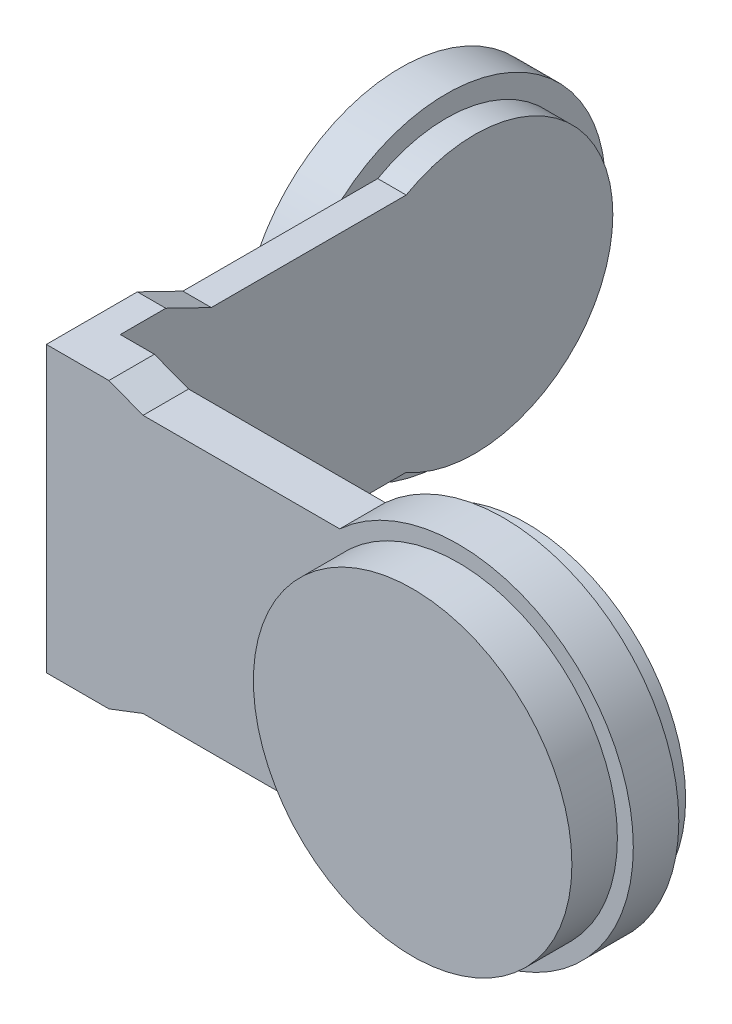
ISO-10303-21;
HEADER;
FILE_DESCRIPTION(('STEP AP214'),'2;1');
FILE_NAME('part.step','',(''),(''),'','','');
FILE_SCHEMA(('AUTOMOTIVE_DESIGN { 1 0 10303 214 1 1 1 1 }'));
ENDSEC;
DATA;
#1=APPLICATION_CONTEXT('core data for automotive mechanical design processes');
#2=APPLICATION_PROTOCOL_DEFINITION('international standard','automotive_design',2000,#1);
#3=PRODUCT_CONTEXT('',#1,'mechanical');
#4=PRODUCT('Part','Part','',(#3));
#5=PRODUCT_RELATED_PRODUCT_CATEGORY('part','',(#4));
#6=PRODUCT_DEFINITION_FORMATION('','',#4);
#7=PRODUCT_DEFINITION_CONTEXT('part definition',#1,'design');
#8=PRODUCT_DEFINITION('design','',#6,#7);
#9=PRODUCT_DEFINITION_SHAPE('','',#8);
#10=(LENGTH_UNIT() NAMED_UNIT(*) SI_UNIT(.MILLI.,.METRE.));
#11=(NAMED_UNIT(*) PLANE_ANGLE_UNIT() SI_UNIT($,.RADIAN.));
#12=(NAMED_UNIT(*) SI_UNIT($,.STERADIAN.) SOLID_ANGLE_UNIT());
#13=UNCERTAINTY_MEASURE_WITH_UNIT(LENGTH_MEASURE(1.E-05),#10,'distance_accuracy_value','');
#14=(GEOMETRIC_REPRESENTATION_CONTEXT(3) GLOBAL_UNCERTAINTY_ASSIGNED_CONTEXT((#13)) GLOBAL_UNIT_ASSIGNED_CONTEXT((#10,
#11,#12)) REPRESENTATION_CONTEXT('',''));
#15=CARTESIAN_POINT('',(0.,0.,0.));
#16=DIRECTION('',(0.,0.,1.));
#17=DIRECTION('',(1.,0.,0.));
#18=AXIS2_PLACEMENT_3D('',#15,#16,#17);
#19=CARTESIAN_POINT('',(6.5,0.,0.));
#20=DIRECTION('',(1.,0.,0.));
#21=DIRECTION('',(0.,0.,-1.));
#22=AXIS2_PLACEMENT_3D('',#19,#20,#21);
#23=PLANE('',#22);
#24=DIRECTION('',(0.,0.,1.));
#25=VECTOR('',#24,1.);
#26=CARTESIAN_POINT('',(6.5,12.5,35.15));
#27=LINE('',#26,#25);
#28=CARTESIAN_POINT('',(6.5,12.5,27.15));
#29=VERTEX_POINT('',#28);
#30=CARTESIAN_POINT('',(6.5,12.5,31.15));
#31=VERTEX_POINT('',#30);
#32=EDGE_CURVE('E218',#29,#31,#27,.T.);
#33=ORIENTED_EDGE('',*,*,#32,.T.);
#34=DIRECTION('',(0.,-1.,0.));
#35=VECTOR('',#34,1.);
#36=CARTESIAN_POINT('',(6.5,12.5,31.15));
#37=LINE('',#36,#35);
#38=CARTESIAN_POINT('',(6.5,-12.5,31.15));
#39=VERTEX_POINT('',#38);
#40=EDGE_CURVE('E164',#31,#39,#37,.T.);
#41=ORIENTED_EDGE('',*,*,#40,.T.);
#42=DIRECTION('',(0.,0.,-1.));
#43=VECTOR('',#42,1.);
#44=CARTESIAN_POINT('',(6.5,-12.5,35.15));
#45=LINE('',#44,#43);
#46=CARTESIAN_POINT('',(6.5,-12.5,27.15));
#47=VERTEX_POINT('',#46);
#48=EDGE_CURVE('E163',#39,#47,#45,.T.);
#49=ORIENTED_EDGE('',*,*,#48,.T.);
#50=DIRECTION('',(0.,0.437246930529629,-0.899341493395261));
#51=VECTOR('',#50,1.);
#52=CARTESIAN_POINT('',(6.5,-12.5,27.15));
#53=LINE('',#52,#51);
#54=CARTESIAN_POINT('',(6.5,-10.5552573911434,23.15));
#55=VERTEX_POINT('',#54);
#56=EDGE_CURVE('E206',#47,#55,#53,.T.);
#57=ORIENTED_EDGE('',*,*,#56,.T.);
#58=DIRECTION('',(0.,0.,-1.));
#59=VECTOR('',#58,1.);
#60=CARTESIAN_POINT('',(6.5,-10.5552573911434,23.15));
#61=LINE('',#60,#59);
#62=CARTESIAN_POINT('',(6.5,-10.5552573911434,6.0173949020081));
#63=VERTEX_POINT('',#62);
#64=EDGE_CURVE('E209',#55,#63,#61,.T.);
#65=ORIENTED_EDGE('',*,*,#64,.T.);
#66=CARTESIAN_POINT('',(6.5,0.,0.));
#67=DIRECTION('',(1.,0.,0.));
#68=DIRECTION('',(0.,0.,-1.));
#69=AXIS2_PLACEMENT_3D('',#66,#67,#68);
#70=CIRCLE('',#69,12.15);
#71=CARTESIAN_POINT('',(6.5,10.5552573911434,6.0173949020081));
#72=VERTEX_POINT('',#71);
#73=EDGE_CURVE('E212',#63,#72,#70,.T.);
#74=ORIENTED_EDGE('',*,*,#73,.T.);
#75=DIRECTION('',(0.,0.,1.));
#76=VECTOR('',#75,1.);
#77=CARTESIAN_POINT('',(6.5,10.5552573911434,23.15));
#78=LINE('',#77,#76);
#79=CARTESIAN_POINT('',(6.5,10.5552573911434,23.15));
#80=VERTEX_POINT('',#79);
#81=EDGE_CURVE('E214',#72,#80,#78,.T.);
#82=ORIENTED_EDGE('',*,*,#81,.T.);
#83=DIRECTION('',(0.,0.437246930529628,0.899341493395261));
#84=VECTOR('',#83,1.);
#85=CARTESIAN_POINT('',(6.5,12.5,27.15));
#86=LINE('',#85,#84);
#87=EDGE_CURVE('E216',#80,#29,#86,.T.);
#88=ORIENTED_EDGE('',*,*,#87,.T.);
#89=EDGE_LOOP('',(#33,#41,#49,#57,#65,#74,#82,#88));
#90=FACE_BOUND('',#89,.T.);
#91=ADVANCED_FACE('F35',(#90),#23,.T.);
#92=CARTESIAN_POINT('',(4.,0.,0.));
#93=DIRECTION('',(-1.,0.,0.));
#94=DIRECTION('',(0.,0.,1.));
#95=AXIS2_PLACEMENT_3D('',#92,#93,#94);
#96=CYLINDRICAL_SURFACE('',#95,14.);
#97=CARTESIAN_POINT('',(4.,0.,0.));
#98=DIRECTION('',(1.,0.,0.));
#99=DIRECTION('',(0.,0.,-1.));
#100=AXIS2_PLACEMENT_3D('',#97,#98,#99);
#101=CIRCLE('',#100,14.);
#102=CARTESIAN_POINT('',(4.,10.5552573911434,9.19709418276844));
#103=VERTEX_POINT('',#102);
#104=CARTESIAN_POINT('',(4.,-10.5552573911434,9.19709418276844));
#105=VERTEX_POINT('',#104);
#106=EDGE_CURVE('E263',#103,#105,#101,.T.);
#107=ORIENTED_EDGE('',*,*,#106,.F.);
#108=EDGE_CURVE('E265',#105,#103,#101,.T.);
#109=ORIENTED_EDGE('',*,*,#108,.F.);
#110=EDGE_LOOP('',(#107,#109));
#111=FACE_BOUND('',#110,.T.);
#112=CARTESIAN_POINT('',(0.,0.,0.));
#113=DIRECTION('',(1.,0.,0.));
#114=DIRECTION('',(0.,0.,-1.));
#115=AXIS2_PLACEMENT_3D('',#112,#113,#114);
#116=CIRCLE('',#115,14.);
#117=CARTESIAN_POINT('',(0.,0.,-14.));
#118=VERTEX_POINT('',#117);
#119=EDGE_CURVE('E262',#118,#118,#116,.T.);
#120=ORIENTED_EDGE('',*,*,#119,.T.);
#121=EDGE_LOOP('',(#120));
#122=FACE_BOUND('',#121,.T.);
#123=ADVANCED_FACE('F37',(#111,#122),#96,.T.);
#124=CARTESIAN_POINT('',(4.,0.,0.));
#125=DIRECTION('',(1.,0.,0.));
#126=DIRECTION('',(0.,0.,-1.));
#127=AXIS2_PLACEMENT_3D('',#124,#125,#126);
#128=PLANE('',#127);
#129=DIRECTION('',(0.,0.,1.));
#130=VECTOR('',#129,1.);
#131=CARTESIAN_POINT('',(4.,10.5552573911434,23.15));
#132=LINE('',#131,#130);
#133=CARTESIAN_POINT('',(4.,10.5552573911434,6.0173949020081));
#134=VERTEX_POINT('',#133);
#135=EDGE_CURVE('E58',#134,#103,#132,.T.);
#136=ORIENTED_EDGE('',*,*,#135,.F.);
#137=CARTESIAN_POINT('',(4.,0.,0.));
#138=DIRECTION('',(1.,0.,0.));
#139=DIRECTION('',(0.,0.,-1.));
#140=AXIS2_PLACEMENT_3D('',#137,#138,#139);
#141=CIRCLE('',#140,12.15);
#142=CARTESIAN_POINT('',(4.,-10.5552573911434,6.0173949020081));
#143=VERTEX_POINT('',#142);
#144=EDGE_CURVE('E228',#143,#134,#141,.T.);
#145=ORIENTED_EDGE('',*,*,#144,.F.);
#146=DIRECTION('',(0.,0.,-1.));
#147=VECTOR('',#146,1.);
#148=CARTESIAN_POINT('',(4.,-10.5552573911434,23.15));
#149=LINE('',#148,#147);
#150=EDGE_CURVE('E229',#105,#143,#149,.T.);
#151=ORIENTED_EDGE('',*,*,#150,.F.);
#152=ORIENTED_EDGE('',*,*,#108,.T.);
#153=EDGE_LOOP('',(#136,#145,#151,#152));
#154=FACE_BOUND('',#153,.T.);
#155=ADVANCED_FACE('F271',(#154),#128,.T.);
#156=CARTESIAN_POINT('',(0.,0.,0.));
#157=DIRECTION('',(1.,0.,0.));
#158=DIRECTION('',(0.,0.,-1.));
#159=AXIS2_PLACEMENT_3D('',#156,#157,#158);
#160=PLANE('',#159);
#161=ORIENTED_EDGE('',*,*,#119,.F.);
#162=EDGE_LOOP('',(#161));
#163=FACE_BOUND('',#162,.T.);
#164=ADVANCED_FACE('F332',(#163),#160,.F.);
#165=CARTESIAN_POINT('',(4.,0.,0.));
#166=DIRECTION('',(1.,0.,0.));
#167=DIRECTION('',(0.,0.,-1.));
#168=AXIS2_PLACEMENT_3D('',#165,#166,#167);
#169=PLANE('',#168);
#170=CARTESIAN_POINT('',(4.,10.5552573911434,23.15));
#171=VERTEX_POINT('',#170);
#172=EDGE_CURVE('E231',#103,#171,#132,.T.);
#173=ORIENTED_EDGE('',*,*,#172,.F.);
#174=ORIENTED_EDGE('',*,*,#106,.T.);
#175=CARTESIAN_POINT('',(4.,-10.5552573911434,23.15));
#176=VERTEX_POINT('',#175);
#177=EDGE_CURVE('E225',#176,#105,#149,.T.);
#178=ORIENTED_EDGE('',*,*,#177,.F.);
#179=DIRECTION('',(0.,0.437246930529629,-0.899341493395261));
#180=VECTOR('',#179,1.);
#181=CARTESIAN_POINT('',(4.,-12.5,27.15));
#182=LINE('',#181,#180);
#183=CARTESIAN_POINT('',(4.,-12.5,27.15));
#184=VERTEX_POINT('',#183);
#185=EDGE_CURVE('E198',#184,#176,#182,.T.);
#186=ORIENTED_EDGE('',*,*,#185,.F.);
#187=DIRECTION('',(0.,0.,-1.));
#188=VECTOR('',#187,1.);
#189=CARTESIAN_POINT('',(4.,-12.5,35.15));
#190=LINE('',#189,#188);
#191=CARTESIAN_POINT('',(4.,-12.5,35.15));
#192=VERTEX_POINT('',#191);
#193=EDGE_CURVE('E210',#192,#184,#190,.T.);
#194=ORIENTED_EDGE('',*,*,#193,.F.);
#195=DIRECTION('',(0.,-1.,0.));
#196=VECTOR('',#195,1.);
#197=CARTESIAN_POINT('',(4.,12.5,35.15));
#198=LINE('',#197,#196);
#199=CARTESIAN_POINT('',(4.,12.5,35.15));
#200=VERTEX_POINT('',#199);
#201=EDGE_CURVE('E237',#200,#192,#198,.T.);
#202=ORIENTED_EDGE('',*,*,#201,.F.);
#203=DIRECTION('',(0.,0.,1.));
#204=VECTOR('',#203,1.);
#205=CARTESIAN_POINT('',(4.,12.5,35.15));
#206=LINE('',#205,#204);
#207=CARTESIAN_POINT('',(4.,12.5,27.15));
#208=VERTEX_POINT('',#207);
#209=EDGE_CURVE('E235',#208,#200,#206,.T.);
#210=ORIENTED_EDGE('',*,*,#209,.F.);
#211=DIRECTION('',(0.,0.437246930529628,0.899341493395261));
#212=VECTOR('',#211,1.);
#213=CARTESIAN_POINT('',(4.,12.5,27.15));
#214=LINE('',#213,#212);
#215=EDGE_CURVE('E233',#171,#208,#214,.T.);
#216=ORIENTED_EDGE('',*,*,#215,.F.);
#217=EDGE_LOOP('',(#173,#174,#178,#186,#194,#202,#210,#216));
#218=FACE_BOUND('',#217,.T.);
#219=ADVANCED_FACE('F277',(#218),#169,.F.);
#220=CARTESIAN_POINT('',(6.5,-12.5,27.15));
#221=DIRECTION('',(0.,0.899341493395261,0.437246930529629));
#222=DIRECTION('',(0.,-0.437246930529629,0.899341493395261));
#223=AXIS2_PLACEMENT_3D('',#220,#221,#222);
#224=PLANE('',#223);
#225=ORIENTED_EDGE('',*,*,#185,.T.);
#226=DIRECTION('',(-1.,0.,0.));
#227=VECTOR('',#226,1.);
#228=CARTESIAN_POINT('',(6.5,-10.5552573911434,23.15));
#229=LINE('',#228,#227);
#230=EDGE_CURVE('E259',#55,#176,#229,.T.);
#231=ORIENTED_EDGE('',*,*,#230,.F.);
#232=ORIENTED_EDGE('',*,*,#56,.F.);
#233=DIRECTION('',(-1.,0.,0.));
#234=VECTOR('',#233,1.);
#235=CARTESIAN_POINT('',(6.5,-12.5,27.15));
#236=LINE('',#235,#234);
#237=EDGE_CURVE('E222',#47,#184,#236,.T.);
#238=ORIENTED_EDGE('',*,*,#237,.T.);
#239=EDGE_LOOP('',(#225,#231,#232,#238));
#240=FACE_BOUND('',#239,.T.);
#241=ADVANCED_FACE('F331',(#240),#224,.F.);
#242=CARTESIAN_POINT('',(6.5,-10.5552573911434,23.15));
#243=DIRECTION('',(0.,1.,0.));
#244=DIRECTION('',(0.,0.,1.));
#245=AXIS2_PLACEMENT_3D('',#242,#243,#244);
#246=PLANE('',#245);
#247=ORIENTED_EDGE('',*,*,#177,.T.);
#248=ORIENTED_EDGE('',*,*,#150,.T.);
#249=DIRECTION('',(-1.,0.,0.));
#250=VECTOR('',#249,1.);
#251=CARTESIAN_POINT('',(6.5,-10.5552573911434,6.0173949020081));
#252=LINE('',#251,#250);
#253=EDGE_CURVE('E256',#63,#143,#252,.T.);
#254=ORIENTED_EDGE('',*,*,#253,.F.);
#255=ORIENTED_EDGE('',*,*,#64,.F.);
#256=ORIENTED_EDGE('',*,*,#230,.T.);
#257=EDGE_LOOP('',(#247,#248,#254,#255,#256));
#258=FACE_BOUND('',#257,.T.);
#259=ADVANCED_FACE('F289',(#258),#246,.F.);
#260=CARTESIAN_POINT('',(6.5,0.,0.));
#261=DIRECTION('',(-1.,0.,0.));
#262=DIRECTION('',(0.,0.,1.));
#263=AXIS2_PLACEMENT_3D('',#260,#261,#262);
#264=CYLINDRICAL_SURFACE('',#263,12.15);
#265=ORIENTED_EDGE('',*,*,#144,.T.);
#266=DIRECTION('',(-1.,0.,0.));
#267=VECTOR('',#266,1.);
#268=CARTESIAN_POINT('',(6.5,10.5552573911434,6.0173949020081));
#269=LINE('',#268,#267);
#270=EDGE_CURVE('E253',#72,#134,#269,.T.);
#271=ORIENTED_EDGE('',*,*,#270,.F.);
#272=ORIENTED_EDGE('',*,*,#73,.F.);
#273=ORIENTED_EDGE('',*,*,#253,.T.);
#274=EDGE_LOOP('',(#265,#271,#272,#273));
#275=FACE_BOUND('',#274,.T.);
#276=ADVANCED_FACE('F286',(#275),#264,.T.);
#277=CARTESIAN_POINT('',(6.5,10.5552573911434,23.15));
#278=DIRECTION('',(0.,-1.,0.));
#279=DIRECTION('',(0.,0.,-1.));
#280=AXIS2_PLACEMENT_3D('',#277,#278,#279);
#281=PLANE('',#280);
#282=ORIENTED_EDGE('',*,*,#135,.T.);
#283=ORIENTED_EDGE('',*,*,#172,.T.);
#284=DIRECTION('',(-1.,0.,0.));
#285=VECTOR('',#284,1.);
#286=CARTESIAN_POINT('',(6.5,10.5552573911434,23.15));
#287=LINE('',#286,#285);
#288=EDGE_CURVE('E250',#80,#171,#287,.T.);
#289=ORIENTED_EDGE('',*,*,#288,.F.);
#290=ORIENTED_EDGE('',*,*,#81,.F.);
#291=ORIENTED_EDGE('',*,*,#270,.T.);
#292=EDGE_LOOP('',(#282,#283,#289,#290,#291));
#293=FACE_BOUND('',#292,.T.);
#294=ADVANCED_FACE('F281',(#293),#281,.F.);
#295=CARTESIAN_POINT('',(6.5,12.5,27.15));
#296=DIRECTION('',(0.,-0.899341493395261,0.437246930529628));
#297=DIRECTION('',(0.,-0.437246930529628,-0.899341493395261));
#298=AXIS2_PLACEMENT_3D('',#295,#296,#297);
#299=PLANE('',#298);
#300=ORIENTED_EDGE('',*,*,#215,.T.);
#301=DIRECTION('',(-1.,0.,0.));
#302=VECTOR('',#301,1.);
#303=CARTESIAN_POINT('',(6.5,12.5,27.15));
#304=LINE('',#303,#302);
#305=EDGE_CURVE('E247',#29,#208,#304,.T.);
#306=ORIENTED_EDGE('',*,*,#305,.F.);
#307=ORIENTED_EDGE('',*,*,#87,.F.);
#308=ORIENTED_EDGE('',*,*,#288,.T.);
#309=EDGE_LOOP('',(#300,#306,#307,#308));
#310=FACE_BOUND('',#309,.T.);
#311=ADVANCED_FACE('F343',(#310),#299,.F.);
#312=CARTESIAN_POINT('',(6.5,12.5,35.15));
#313=DIRECTION('',(0.,-1.,0.));
#314=DIRECTION('',(0.,0.,-1.));
#315=AXIS2_PLACEMENT_3D('',#312,#313,#314);
#316=PLANE('',#315);
#317=ORIENTED_EDGE('',*,*,#209,.T.);
#318=DIRECTION('',(-1.,0.,0.));
#319=VECTOR('',#318,1.);
#320=CARTESIAN_POINT('',(6.5,12.5,35.15));
#321=LINE('',#320,#319);
#322=CARTESIAN_POINT('',(9.5,12.5,35.15));
#323=VERTEX_POINT('',#322);
#324=EDGE_CURVE('E244',#323,#200,#321,.T.);
#325=ORIENTED_EDGE('',*,*,#324,.F.);
#326=DIRECTION('',(0.,0.,1.));
#327=VECTOR('',#326,1.);
#328=CARTESIAN_POINT('',(9.5,12.5,31.15));
#329=LINE('',#328,#327);
#330=CARTESIAN_POINT('',(9.5,12.5,31.15));
#331=VERTEX_POINT('',#330);
#332=EDGE_CURVE('E195',#331,#323,#329,.T.);
#333=ORIENTED_EDGE('',*,*,#332,.F.);
#334=DIRECTION('',(-1.,0.,0.));
#335=VECTOR('',#334,1.);
#336=CARTESIAN_POINT('',(6.5,12.5,31.15));
#337=LINE('',#336,#335);
#338=EDGE_CURVE('E152',#331,#31,#337,.T.);
#339=ORIENTED_EDGE('',*,*,#338,.T.);
#340=ORIENTED_EDGE('',*,*,#32,.F.);
#341=ORIENTED_EDGE('',*,*,#305,.T.);
#342=EDGE_LOOP('',(#317,#325,#333,#339,#340,#341));
#343=FACE_BOUND('',#342,.T.);
#344=ADVANCED_FACE('F339',(#343),#316,.F.);
#345=CARTESIAN_POINT('',(6.5,12.5,35.15));
#346=DIRECTION('',(0.,0.,-1.));
#347=DIRECTION('',(-1.,0.,0.));
#348=AXIS2_PLACEMENT_3D('',#345,#346,#347);
#349=PLANE('',#348);
#350=CARTESIAN_POINT('',(40.2,0.,35.15));
#351=DIRECTION('',(0.,0.,1.));
#352=DIRECTION('',(1.,0.,0.));
#353=AXIS2_PLACEMENT_3D('',#350,#351,#352);
#354=CIRCLE('',#353,14.);
#355=CARTESIAN_POINT('',(54.2,0.,35.15));
#356=VERTEX_POINT('',#355);
#357=EDGE_CURVE('E43',#356,#356,#354,.T.);
#358=ORIENTED_EDGE('',*,*,#357,.F.);
#359=EDGE_LOOP('',(#358));
#360=FACE_BOUND('',#359,.T.);
#361=ORIENTED_EDGE('',*,*,#201,.T.);
#362=DIRECTION('',(-1.,0.,0.));
#363=VECTOR('',#362,1.);
#364=CARTESIAN_POINT('',(6.5,-12.5,35.15));
#365=LINE('',#364,#363);
#366=CARTESIAN_POINT('',(9.5,-12.5,35.15));
#367=VERTEX_POINT('',#366);
#368=EDGE_CURVE('E242',#367,#192,#365,.T.);
#369=ORIENTED_EDGE('',*,*,#368,.F.);
#370=DIRECTION('',(0.933746117302049,0.357936011632454,0.));
#371=VECTOR('',#370,1.);
#372=CARTESIAN_POINT('',(9.5,-12.5,35.15));
#373=LINE('',#372,#371);
#374=CARTESIAN_POINT('',(12.5,-11.35,35.15));
#375=VERTEX_POINT('',#374);
#376=EDGE_CURVE('E148',#367,#375,#373,.T.);
#377=ORIENTED_EDGE('',*,*,#376,.T.);
#378=DIRECTION('',(1.,0.,0.));
#379=VECTOR('',#378,1.);
#380=CARTESIAN_POINT('',(12.5,-11.35,35.15));
#381=LINE('',#380,#379);
#382=CARTESIAN_POINT('',(29.7914698444017,-11.35,35.15));
#383=VERTEX_POINT('',#382);
#384=EDGE_CURVE('E183',#375,#383,#381,.T.);
#385=ORIENTED_EDGE('',*,*,#384,.T.);
#386=CARTESIAN_POINT('',(40.2,0.,35.15));
#387=DIRECTION('',(0.,0.,1.));
#388=DIRECTION('',(1.,0.,0.));
#389=AXIS2_PLACEMENT_3D('',#386,#387,#388);
#390=CIRCLE('',#389,15.4);
#391=CARTESIAN_POINT('',(29.7914698444017,11.35,35.15));
#392=VERTEX_POINT('',#391);
#393=EDGE_CURVE('E187',#383,#392,#390,.T.);
#394=ORIENTED_EDGE('',*,*,#393,.T.);
#395=DIRECTION('',(-1.,0.,0.));
#396=VECTOR('',#395,1.);
#397=CARTESIAN_POINT('',(12.5,11.35,35.15));
#398=LINE('',#397,#396);
#399=CARTESIAN_POINT('',(12.5,11.35,35.15));
#400=VERTEX_POINT('',#399);
#401=EDGE_CURVE('E190',#392,#400,#398,.T.);
#402=ORIENTED_EDGE('',*,*,#401,.T.);
#403=DIRECTION('',(-0.933746117302049,0.357936011632454,0.));
#404=VECTOR('',#403,1.);
#405=CARTESIAN_POINT('',(9.5,12.5,35.15));
#406=LINE('',#405,#404);
#407=EDGE_CURVE('E166',#400,#323,#406,.T.);
#408=ORIENTED_EDGE('',*,*,#407,.T.);
#409=ORIENTED_EDGE('',*,*,#324,.T.);
#410=EDGE_LOOP('',(#361,#369,#377,#385,#394,#402,#408,#409));
#411=FACE_BOUND('',#410,.T.);
#412=ADVANCED_FACE('F336',(#360,#411),#349,.F.);
#413=CARTESIAN_POINT('',(6.5,-12.5,35.15));
#414=DIRECTION('',(0.,1.,0.));
#415=DIRECTION('',(0.,0.,1.));
#416=AXIS2_PLACEMENT_3D('',#413,#414,#415);
#417=PLANE('',#416);
#418=ORIENTED_EDGE('',*,*,#193,.T.);
#419=ORIENTED_EDGE('',*,*,#237,.F.);
#420=ORIENTED_EDGE('',*,*,#48,.F.);
#421=DIRECTION('',(1.,0.,0.));
#422=VECTOR('',#421,1.);
#423=CARTESIAN_POINT('',(6.5,-12.5,31.15));
#424=LINE('',#423,#422);
#425=CARTESIAN_POINT('',(9.5,-12.5,31.15));
#426=VERTEX_POINT('',#425);
#427=EDGE_CURVE('E50',#39,#426,#424,.T.);
#428=ORIENTED_EDGE('',*,*,#427,.T.);
#429=DIRECTION('',(0.,0.,1.));
#430=VECTOR('',#429,1.);
#431=CARTESIAN_POINT('',(9.5,-12.5,31.15));
#432=LINE('',#431,#430);
#433=EDGE_CURVE('E144',#426,#367,#432,.T.);
#434=ORIENTED_EDGE('',*,*,#433,.T.);
#435=ORIENTED_EDGE('',*,*,#368,.T.);
#436=EDGE_LOOP('',(#418,#419,#420,#428,#434,#435));
#437=FACE_BOUND('',#436,.T.);
#438=ADVANCED_FACE('F161',(#437),#417,.F.);
#439=CARTESIAN_POINT('',(9.5,12.5,31.15));
#440=DIRECTION('',(0.357936011632454,0.933746117302049,0.));
#441=DIRECTION('',(-0.933746117302049,0.357936011632454,0.));
#442=AXIS2_PLACEMENT_3D('',#439,#440,#441);
#443=PLANE('',#442);
#444=ORIENTED_EDGE('',*,*,#407,.F.);
#445=DIRECTION('',(0.,0.,1.));
#446=VECTOR('',#445,1.);
#447=CARTESIAN_POINT('',(12.5,11.35,31.15));
#448=LINE('',#447,#446);
#449=CARTESIAN_POINT('',(12.5,11.35,31.15));
#450=VERTEX_POINT('',#449);
#451=EDGE_CURVE('E199',#450,#400,#448,.T.);
#452=ORIENTED_EDGE('',*,*,#451,.F.);
#453=DIRECTION('',(-0.933746117302049,0.357936011632454,0.));
#454=VECTOR('',#453,1.);
#455=CARTESIAN_POINT('',(9.5,12.5,31.15));
#456=LINE('',#455,#454);
#457=EDGE_CURVE('E177',#450,#331,#456,.T.);
#458=ORIENTED_EDGE('',*,*,#457,.T.);
#459=ORIENTED_EDGE('',*,*,#332,.T.);
#460=EDGE_LOOP('',(#444,#452,#458,#459));
#461=FACE_BOUND('',#460,.T.);
#462=ADVANCED_FACE('F335',(#461),#443,.T.);
#463=CARTESIAN_POINT('',(12.5,11.35,31.15));
#464=DIRECTION('',(0.,1.,0.));
#465=DIRECTION('',(-1.,0.,0.));
#466=AXIS2_PLACEMENT_3D('',#463,#464,#465);
#467=PLANE('',#466);
#468=ORIENTED_EDGE('',*,*,#401,.F.);
#469=DIRECTION('',(0.,0.,1.));
#470=VECTOR('',#469,1.);
#471=CARTESIAN_POINT('',(29.7914698444017,11.35,31.15));
#472=LINE('',#471,#470);
#473=CARTESIAN_POINT('',(29.7914698444017,11.35,31.15));
#474=VERTEX_POINT('',#473);
#475=EDGE_CURVE('E201',#474,#392,#472,.T.);
#476=ORIENTED_EDGE('',*,*,#475,.F.);
#477=DIRECTION('',(-1.,0.,0.));
#478=VECTOR('',#477,1.);
#479=CARTESIAN_POINT('',(12.5,11.35,31.15));
#480=LINE('',#479,#478);
#481=EDGE_CURVE('E174',#474,#450,#480,.T.);
#482=ORIENTED_EDGE('',*,*,#481,.T.);
#483=ORIENTED_EDGE('',*,*,#451,.T.);
#484=EDGE_LOOP('',(#468,#476,#482,#483));
#485=FACE_BOUND('',#484,.T.);
#486=ADVANCED_FACE('F409',(#485),#467,.T.);
#487=CARTESIAN_POINT('',(40.2,0.,31.15));
#488=DIRECTION('',(0.,0.,1.));
#489=DIRECTION('',(1.,0.,0.));
#490=AXIS2_PLACEMENT_3D('',#487,#488,#489);
#491=CYLINDRICAL_SURFACE('',#490,15.4);
#492=ORIENTED_EDGE('',*,*,#393,.F.);
#493=DIRECTION('',(0.,0.,1.));
#494=VECTOR('',#493,1.);
#495=CARTESIAN_POINT('',(29.7914698444017,-11.35,31.15));
#496=LINE('',#495,#494);
#497=CARTESIAN_POINT('',(29.7914698444017,-11.35,31.15));
#498=VERTEX_POINT('',#497);
#499=EDGE_CURVE('E203',#498,#383,#496,.T.);
#500=ORIENTED_EDGE('',*,*,#499,.F.);
#501=CARTESIAN_POINT('',(40.2,0.,31.15));
#502=DIRECTION('',(0.,0.,1.));
#503=DIRECTION('',(1.,0.,0.));
#504=AXIS2_PLACEMENT_3D('',#501,#502,#503);
#505=CIRCLE('',#504,15.4);
#506=EDGE_CURVE('E171',#498,#474,#505,.T.);
#507=ORIENTED_EDGE('',*,*,#506,.T.);
#508=ORIENTED_EDGE('',*,*,#475,.T.);
#509=EDGE_LOOP('',(#492,#500,#507,#508));
#510=FACE_BOUND('',#509,.T.);
#511=ADVANCED_FACE('F416',(#510),#491,.T.);
#512=CARTESIAN_POINT('',(12.5,-11.35,31.15));
#513=DIRECTION('',(0.,-1.,0.));
#514=DIRECTION('',(0.,0.,-1.));
#515=AXIS2_PLACEMENT_3D('',#512,#513,#514);
#516=PLANE('',#515);
#517=ORIENTED_EDGE('',*,*,#384,.F.);
#518=DIRECTION('',(0.,0.,1.));
#519=VECTOR('',#518,1.);
#520=CARTESIAN_POINT('',(12.5,-11.35,31.15));
#521=LINE('',#520,#519);
#522=CARTESIAN_POINT('',(12.5,-11.35,31.15));
#523=VERTEX_POINT('',#522);
#524=EDGE_CURVE('E151',#523,#375,#521,.T.);
#525=ORIENTED_EDGE('',*,*,#524,.F.);
#526=DIRECTION('',(1.,0.,0.));
#527=VECTOR('',#526,1.);
#528=CARTESIAN_POINT('',(12.5,-11.35,31.15));
#529=LINE('',#528,#527);
#530=EDGE_CURVE('E158',#523,#498,#529,.T.);
#531=ORIENTED_EDGE('',*,*,#530,.T.);
#532=ORIENTED_EDGE('',*,*,#499,.T.);
#533=EDGE_LOOP('',(#517,#525,#531,#532));
#534=FACE_BOUND('',#533,.T.);
#535=ADVANCED_FACE('F318',(#534),#516,.T.);
#536=CARTESIAN_POINT('',(9.5,-12.5,31.15));
#537=DIRECTION('',(0.357936011632454,-0.933746117302049,0.));
#538=DIRECTION('',(0.933746117302049,0.357936011632454,0.));
#539=AXIS2_PLACEMENT_3D('',#536,#537,#538);
#540=PLANE('',#539);
#541=ORIENTED_EDGE('',*,*,#376,.F.);
#542=ORIENTED_EDGE('',*,*,#433,.F.);
#543=DIRECTION('',(0.933746117302049,0.357936011632454,0.));
#544=VECTOR('',#543,1.);
#545=CARTESIAN_POINT('',(9.5,-12.5,31.15));
#546=LINE('',#545,#544);
#547=EDGE_CURVE('E146',#426,#523,#546,.T.);
#548=ORIENTED_EDGE('',*,*,#547,.T.);
#549=ORIENTED_EDGE('',*,*,#524,.T.);
#550=EDGE_LOOP('',(#541,#542,#548,#549));
#551=FACE_BOUND('',#550,.T.);
#552=ADVANCED_FACE('F145',(#551),#540,.T.);
#553=CARTESIAN_POINT('',(40.2,0.,31.15));
#554=DIRECTION('',(0.,0.,1.));
#555=DIRECTION('',(1.,0.,0.));
#556=AXIS2_PLACEMENT_3D('',#553,#554,#555);
#557=PLANE('',#556);
#558=CARTESIAN_POINT('',(40.2,0.,31.15));
#559=DIRECTION('',(0.,0.,1.));
#560=DIRECTION('',(1.,0.,0.));
#561=AXIS2_PLACEMENT_3D('',#558,#559,#560);
#562=CIRCLE('',#561,14.);
#563=CARTESIAN_POINT('',(54.2,0.,31.15));
#564=VERTEX_POINT('',#563);
#565=EDGE_CURVE('E11',#564,#564,#562,.F.);
#566=ORIENTED_EDGE('',*,*,#565,.F.);
#567=EDGE_LOOP('',(#566));
#568=FACE_BOUND('',#567,.T.);
#569=ORIENTED_EDGE('',*,*,#40,.F.);
#570=ORIENTED_EDGE('',*,*,#338,.F.);
#571=ORIENTED_EDGE('',*,*,#457,.F.);
#572=ORIENTED_EDGE('',*,*,#481,.F.);
#573=ORIENTED_EDGE('',*,*,#506,.F.);
#574=ORIENTED_EDGE('',*,*,#530,.F.);
#575=ORIENTED_EDGE('',*,*,#547,.F.);
#576=ORIENTED_EDGE('',*,*,#427,.F.);
#577=EDGE_LOOP('',(#569,#570,#571,#572,#573,#574,#575,#576));
#578=FACE_BOUND('',#577,.T.);
#579=ADVANCED_FACE('F155',(#568,#578),#557,.F.);
#580=CARTESIAN_POINT('',(40.2,0.,39.15));
#581=DIRECTION('',(0.,0.,-1.));
#582=DIRECTION('',(-1.,0.,0.));
#583=AXIS2_PLACEMENT_3D('',#580,#581,#582);
#584=CYLINDRICAL_SURFACE('',#583,14.);
#585=CARTESIAN_POINT('',(40.2,0.,39.15));
#586=DIRECTION('',(0.,0.,1.));
#587=DIRECTION('',(1.,0.,0.));
#588=AXIS2_PLACEMENT_3D('',#585,#586,#587);
#589=CIRCLE('',#588,14.);
#590=CARTESIAN_POINT('',(54.2,0.,39.15));
#591=VERTEX_POINT('',#590);
#592=EDGE_CURVE('E184',#591,#591,#589,.T.);
#593=ORIENTED_EDGE('',*,*,#592,.F.);
#594=EDGE_LOOP('',(#593));
#595=FACE_BOUND('',#594,.T.);
#596=ORIENTED_EDGE('',*,*,#357,.T.);
#597=EDGE_LOOP('',(#596));
#598=FACE_BOUND('',#597,.T.);
#599=ADVANCED_FACE('F310',(#595,#598),#584,.T.);
#600=CARTESIAN_POINT('',(40.2,0.,39.15));
#601=DIRECTION('',(0.,0.,1.));
#602=DIRECTION('',(1.,0.,0.));
#603=AXIS2_PLACEMENT_3D('',#600,#601,#602);
#604=PLANE('',#603);
#605=ORIENTED_EDGE('',*,*,#592,.T.);
#606=EDGE_LOOP('',(#605));
#607=FACE_BOUND('',#606,.T.);
#608=ADVANCED_FACE('F305',(#607),#604,.T.);
#609=CARTESIAN_POINT('',(40.2,0.,29.15));
#610=DIRECTION('',(0.,0.,1.));
#611=DIRECTION('',(1.,0.,0.));
#612=AXIS2_PLACEMENT_3D('',#609,#610,#611);
#613=CYLINDRICAL_SURFACE('',#612,14.);
#614=CARTESIAN_POINT('',(40.2,0.,29.15));
#615=DIRECTION('',(0.,0.,-1.));
#616=DIRECTION('',(-1.,0.,0.));
#617=AXIS2_PLACEMENT_3D('',#614,#615,#616);
#618=CIRCLE('',#617,14.);
#619=CARTESIAN_POINT('',(26.2,0.,29.15));
#620=VERTEX_POINT('',#619);
#621=EDGE_CURVE('E296',#620,#620,#618,.T.);
#622=ORIENTED_EDGE('',*,*,#621,.F.);
#623=EDGE_LOOP('',(#622));
#624=FACE_BOUND('',#623,.T.);
#625=ORIENTED_EDGE('',*,*,#565,.T.);
#626=EDGE_LOOP('',(#625));
#627=FACE_BOUND('',#626,.T.);
#628=ADVANCED_FACE('F302',(#624,#627),#613,.T.);
#629=CARTESIAN_POINT('',(40.2,0.,29.15));
#630=DIRECTION('',(0.,0.,-1.));
#631=DIRECTION('',(-1.,0.,0.));
#632=AXIS2_PLACEMENT_3D('',#629,#630,#631);
#633=PLANE('',#632);
#634=ORIENTED_EDGE('',*,*,#621,.T.);
#635=EDGE_LOOP('',(#634));
#636=FACE_BOUND('',#635,.T.);
#637=ADVANCED_FACE('F300',(#636),#633,.T.);
#638=CLOSED_SHELL('',(#91,#123,#155,#164,#219,#241,#259,#276,#294,#311,#344,#412,#438,#462,#486,
#511,#535,#552,#579,#599,#608,#628,#637));
#639=MANIFOLD_SOLID_BREP('B2',#638);
#640=ADVANCED_BREP_SHAPE_REPRESENTATION('',(#18,#639),#14);
#641=SHAPE_DEFINITION_REPRESENTATION(#9,#640);
ENDSEC;
END-ISO-10303-21;
